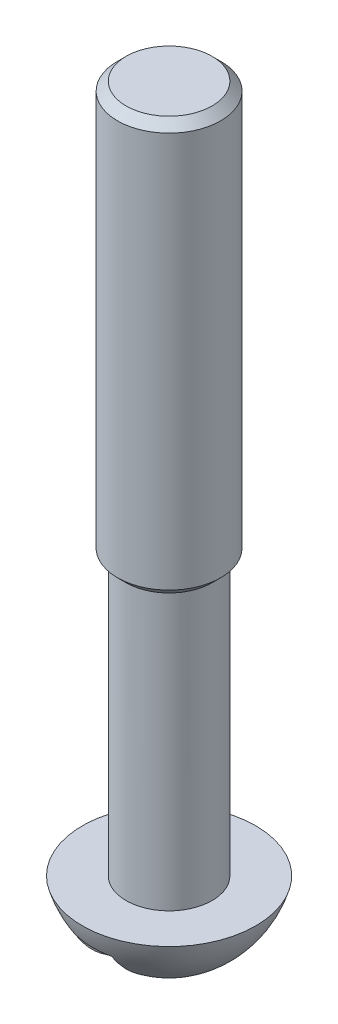
ISO-10303-21;
HEADER;
FILE_DESCRIPTION(('STEP AP214'),'2;1');
FILE_NAME('part.step','',(''),(''),'','','');
FILE_SCHEMA(('AUTOMOTIVE_DESIGN { 1 0 10303 214 1 1 1 1 }'));
ENDSEC;
DATA;
#1=APPLICATION_CONTEXT('core data for automotive mechanical design processes');
#2=APPLICATION_PROTOCOL_DEFINITION('international standard','automotive_design',2000,#1);
#3=PRODUCT_CONTEXT('',#1,'mechanical');
#4=PRODUCT('Part','Part','',(#3));
#5=PRODUCT_RELATED_PRODUCT_CATEGORY('part','',(#4));
#6=PRODUCT_DEFINITION_FORMATION('','',#4);
#7=PRODUCT_DEFINITION_CONTEXT('part definition',#1,'design');
#8=PRODUCT_DEFINITION('design','',#6,#7);
#9=PRODUCT_DEFINITION_SHAPE('','',#8);
#10=(LENGTH_UNIT() NAMED_UNIT(*) SI_UNIT(.MILLI.,.METRE.));
#11=(NAMED_UNIT(*) PLANE_ANGLE_UNIT() SI_UNIT($,.RADIAN.));
#12=(NAMED_UNIT(*) SI_UNIT($,.STERADIAN.) SOLID_ANGLE_UNIT());
#13=UNCERTAINTY_MEASURE_WITH_UNIT(LENGTH_MEASURE(1.E-05),#10,'distance_accuracy_value','');
#14=(GEOMETRIC_REPRESENTATION_CONTEXT(3) GLOBAL_UNCERTAINTY_ASSIGNED_CONTEXT((#13)) GLOBAL_UNIT_ASSIGNED_CONTEXT((#10,
#11,#12)) REPRESENTATION_CONTEXT('',''));
#15=CARTESIAN_POINT('',(0.,0.,0.));
#16=DIRECTION('',(0.,0.,1.));
#17=DIRECTION('',(1.,0.,0.));
#18=AXIS2_PLACEMENT_3D('',#15,#16,#17);
#19=CARTESIAN_POINT('',(0.,0.,0.));
#20=DIRECTION('',(0.,-1.,0.));
#21=DIRECTION('',(1.,0.,0.));
#22=AXIS2_PLACEMENT_3D('',#19,#20,#21);
#23=PLANE('',#22);
#24=CARTESIAN_POINT('',(0.,0.,0.));
#25=DIRECTION('',(0.,-1.,0.));
#26=DIRECTION('',(1.,0.,0.));
#27=AXIS2_PLACEMENT_3D('',#24,#25,#26);
#28=CIRCLE('',#27,2.52);
#29=CARTESIAN_POINT('',(2.52,0.,0.));
#30=VERTEX_POINT('',#29);
#31=EDGE_CURVE('E63',#30,#30,#28,.T.);
#32=ORIENTED_EDGE('',*,*,#31,.F.);
#33=EDGE_LOOP('',(#32));
#34=FACE_BOUND('',#33,.T.);
#35=CARTESIAN_POINT('',(0.,0.,0.));
#36=DIRECTION('',(0.,1.,0.));
#37=DIRECTION('',(-1.,0.,0.));
#38=AXIS2_PLACEMENT_3D('',#35,#36,#37);
#39=CIRCLE('',#38,1.25);
#40=CARTESIAN_POINT('',(-1.25,0.,0.));
#41=VERTEX_POINT('',#40);
#42=EDGE_CURVE('E135',#41,#41,#39,.T.);
#43=ORIENTED_EDGE('',*,*,#42,.F.);
#44=EDGE_LOOP('',(#43));
#45=FACE_BOUND('',#44,.T.);
#46=ADVANCED_FACE('F31',(#34,#45),#23,.F.);
#47=CARTESIAN_POINT('',(0.,0.787302013422015,0.));
#48=DIRECTION('',(0.,-1.,0.));
#49=DIRECTION('',(1.,0.,0.));
#50=AXIS2_PLACEMENT_3D('',#47,#48,#49);
#51=DEGENERATE_TOROIDAL_SURFACE('',#50,0.271085011185012,2.9,.F.);
#52=CARTESIAN_POINT('',(0.,-0.7,0.));
#53=DIRECTION('',(0.,1.,0.));
#54=DIRECTION('',(0.,0.,1.));
#55=AXIS2_PLACEMENT_3D('',#52,#53,#54);
#56=CIRCLE('',#55,2.21847975416471);
#57=CARTESIAN_POINT('',(0.5,-0.699999999999995,-2.16140056899195));
#58=VERTEX_POINT('',#57);
#59=CARTESIAN_POINT('',(-0.5,-0.7,-2.16140056899195));
#60=VERTEX_POINT('',#59);
#61=EDGE_CURVE('E66',#58,#60,#56,.T.);
#62=ORIENTED_EDGE('',*,*,#61,.T.);
#63=CARTESIAN_POINT('',(-0.5,-2.00830666905231,0.));
#64=CARTESIAN_POINT('',(-0.5,-2.00830902523809,0.0428607928409078));
#65=CARTESIAN_POINT('',(-0.5,-2.00677701447295,0.0857176950793083));
#66=CARTESIAN_POINT('',(-0.5,-2.00077477337984,0.171233621065701));
#67=CARTESIAN_POINT('',(-0.5,-1.99630377029604,0.213892589799023));
#68=CARTESIAN_POINT('',(-0.5,-1.98466835662272,0.298948247700139));
#69=CARTESIAN_POINT('',(-0.5,-1.97749705360507,0.341343981069012));
#70=CARTESIAN_POINT('',(-0.5,-1.96072290989855,0.425642081267895));
#71=CARTESIAN_POINT('',(-0.5,-1.95112019303028,0.467544473107811));
#72=CARTESIAN_POINT('',(-0.5,-1.92223725405787,0.579688450377579));
#73=CARTESIAN_POINT('',(-0.5,-1.90086765384547,0.649401072004694));
#74=CARTESIAN_POINT('',(-0.5,-1.85236077305985,0.786781567721751));
#75=CARTESIAN_POINT('',(-0.5,-1.82522117423046,0.854448607424066));
#76=CARTESIAN_POINT('',(-0.5,-1.7357070685999,1.05388466131537));
#77=CARTESIAN_POINT('',(-0.5,-1.66523008748747,1.18211541524716));
#78=CARTESIAN_POINT('',(-0.5,-1.50332276109899,1.42879594104105));
#79=CARTESIAN_POINT('',(-0.5,-1.41144141201418,1.54694726231623));
#80=CARTESIAN_POINT('',(-0.5,-1.21021633244569,1.76722278518401));
#81=CARTESIAN_POINT('',(-0.5,-1.10087932958539,1.86935313151299));
#82=CARTESIAN_POINT('',(-0.5,-0.860273080352937,2.06091763689049));
#83=CARTESIAN_POINT('',(-0.5,-0.728065620900349,2.14917595333445));
#84=CARTESIAN_POINT('',(-0.5,-0.450766012338848,2.30248024074104));
#85=CARTESIAN_POINT('',(-0.5,-0.305669223995743,2.36751781128017));
#86=CARTESIAN_POINT('',(-0.5,-0.00545444206719077,2.47298771259921));
#87=CARTESIAN_POINT('',(-0.5,0.149735660014806,2.5132149447268));
#88=CARTESIAN_POINT('',(-0.5,0.464641057680149,2.5670929362687));
#89=CARTESIAN_POINT('',(-0.5,0.624355819321792,2.58074681838075));
#90=CARTESIAN_POINT('',(-0.5,0.944113367836459,2.58110769648025));
#91=CARTESIAN_POINT('',(-0.5,1.10415621408669,2.56776470732811));
#92=CARTESIAN_POINT('',(-0.5,1.41977014581319,2.51439805056066));
#93=CARTESIAN_POINT('',(-0.5,1.57534014413412,2.47436795270612));
#94=CARTESIAN_POINT('',(-0.5,1.87759317317978,2.36872901137911));
#95=CARTESIAN_POINT('',(-0.5,2.02427341433807,2.30311218643132));
#96=CARTESIAN_POINT('',(-0.5,2.30440826785885,2.14818904246711));
#97=CARTESIAN_POINT('',(-0.5,2.43787250242996,2.05890013523032));
#98=CARTESIAN_POINT('',(-0.5,2.68754734098064,1.85936927954692));
#99=CARTESIAN_POINT('',(-0.5,2.80379777448819,1.749177090265));
#100=CARTESIAN_POINT('',(-0.5,3.01629762837255,1.51039076171608));
#101=CARTESIAN_POINT('',(-0.5,3.11250355365943,1.38175760649792));
#102=CARTESIAN_POINT('',(-0.5,3.23887493368555,1.17844480477896));
#103=CARTESIAN_POINT('',(-0.5,3.27792862814773,1.10914525185096));
#104=CARTESIAN_POINT('',(-0.5,3.34988755890216,0.967377816270646));
#105=CARTESIAN_POINT('',(-0.5,3.38279161292058,0.894909327685369));
#106=CARTESIAN_POINT('',(-0.5,3.44187516124072,0.747575307035428));
#107=CARTESIAN_POINT('',(-0.5,3.46807767101522,0.672718999882114));
#108=CARTESIAN_POINT('',(-0.5,3.51328086602252,0.520852572751832));
#109=CARTESIAN_POINT('',(-0.5,3.5322838918378,0.443843161515936));
#110=CARTESIAN_POINT('',(-0.5,3.55768578585015,0.310579540568608));
#111=CARTESIAN_POINT('',(-0.5,3.5661370787378,0.254715818046524));
#112=CARTESIAN_POINT('',(-0.5,3.57816501396867,0.142485469182349));
#113=CARTESIAN_POINT('',(-0.5,3.58174514159116,0.0861192314817943));
#114=CARTESIAN_POINT('',(-0.5,3.58358888853252,-0.0266645197386601));
#115=CARTESIAN_POINT('',(-0.5,3.58185618571465,-0.0830819707704476));
#116=CARTESIAN_POINT('',(-0.5,3.57331877582221,-0.195548634576939));
#117=CARTESIAN_POINT('',(-0.5,3.56651103425344,-0.251597606793419));
#118=CARTESIAN_POINT('',(-0.5,3.54637785420933,-0.375782803539229));
#119=CARTESIAN_POINT('',(-0.5,3.5319131113656,-0.443732633884875));
#120=CARTESIAN_POINT('',(-0.5,3.49718633392172,-0.578125062699261));
#121=CARTESIAN_POINT('',(-0.5,3.47692300041911,-0.644567319863809));
#122=CARTESIAN_POINT('',(-0.5,3.43105557355988,-0.775837565642575));
#123=CARTESIAN_POINT('',(-0.5,3.40543329582803,-0.840659194226015));
#124=CARTESIAN_POINT('',(-0.5,3.34926248124926,-0.968098039765201));
#125=CARTESIAN_POINT('',(-0.5,3.31871469013967,-1.03071558867944));
#126=CARTESIAN_POINT('',(-0.5,3.21919823082042,-1.216454526155));
#127=CARTESIAN_POINT('',(-0.5,3.14295294179025,-1.33577533609196));
#128=CARTESIAN_POINT('',(-0.5,2.97362070509193,-1.56133292921711));
#129=CARTESIAN_POINT('',(-0.5,2.88056481387892,-1.66759324245783));
#130=CARTESIAN_POINT('',(-0.5,2.66793948747481,-1.87659633287979));
#131=CARTESIAN_POINT('',(-0.5,2.54654543403006,-1.97749429271548));
#132=CARTESIAN_POINT('',(-0.5,2.28862110586937,-2.15788733905101));
#133=CARTESIAN_POINT('',(-0.5,2.15207512678454,-2.2373599209244));
#134=CARTESIAN_POINT('',(-0.5,1.86583734923645,-2.37352878804972));
#135=CARTESIAN_POINT('',(-0.5,1.71599605796425,-2.42991120492598));
#136=CARTESIAN_POINT('',(-0.5,1.40903330432197,-2.5167871749865));
#137=CARTESIAN_POINT('',(-0.5,1.25191367325997,-2.54728720354392));
#138=CARTESIAN_POINT('',(-0.5,0.934290181022326,-2.58162938572399));
#139=CARTESIAN_POINT('',(-0.5,0.773777309344931,-2.58538828009068));
#140=CARTESIAN_POINT('',(-0.5,0.454382437326888,-2.56592048393626));
#141=CARTESIAN_POINT('',(-0.5,0.295500587091198,-2.54269133173875));
#142=CARTESIAN_POINT('',(-0.5,-0.0161898657472835,-2.4698761216843));
#143=CARTESIAN_POINT('',(-0.5,-0.168995378013231,-2.42027683206015));
#144=CARTESIAN_POINT('',(-0.5,-0.464091287042087,-2.29610912288206));
#145=CARTESIAN_POINT('',(-0.5,-0.606382220836688,-2.22154197963776));
#146=CARTESIAN_POINT('',(-0.5,-0.876260298813449,-2.04960277928083));
#147=CARTESIAN_POINT('',(-0.5,-1.00386164773157,-1.95225303390011));
#148=CARTESIAN_POINT('',(-0.5,-1.24082238448772,-1.73744423057207));
#149=CARTESIAN_POINT('',(-0.5,-1.35018077277265,-1.61998407146574));
#150=CARTESIAN_POINT('',(-0.5,-1.54695971528993,-1.36869643690514));
#151=CARTESIAN_POINT('',(-0.5,-1.63448083863165,-1.23494837977945));
#152=CARTESIAN_POINT('',(-0.5,-1.74748301022448,-1.02460752044256));
#153=CARTESIAN_POINT('',(-0.5,-1.7821277229314,-0.952802126809185));
#154=CARTESIAN_POINT('',(-0.5,-1.84490049228109,-0.806412377112441));
#155=CARTESIAN_POINT('',(-0.5,-1.8730328170853,-0.731829878564861));
#156=CARTESIAN_POINT('',(-0.5,-1.91484944880954,-0.603033392826844));
#157=CARTESIAN_POINT('',(-0.5,-1.93033848924262,-0.549398661873268));
#158=CARTESIAN_POINT('',(-0.5,-1.95752526788402,-0.441168906034976));
#159=CARTESIAN_POINT('',(-0.5,-1.96922330554232,-0.386573957356848));
#160=CARTESIAN_POINT('',(-0.5,-1.98831800484734,-0.276860890273204));
#161=CARTESIAN_POINT('',(-0.5,-1.99573246011595,-0.221745916878929));
#162=CARTESIAN_POINT('',(-0.5,-2.00572419134632,-0.111084983102166));
#163=CARTESIAN_POINT('',(-0.5,-2.00830361589523,-0.05553922517566));
#164=CARTESIAN_POINT('',(-0.5,-2.00830666905231,0.));
#165=B_SPLINE_CURVE_WITH_KNOTS('',3,(#63,#64,#65,#66,#67,#68,#69,#70,#71,#72,#73,#74,#75,#76,
#77,#78,#79,#80,#81,#82,#83,#84,#85,#86,#87,#88,#89,#90,#91,#92,#93,#94,#95,#96,#97,#98,#99,
#100,#101,#102,#103,#104,#105,#106,#107,#108,#109,#110,#111,#112,#113,#114,#115,#116,#117,#118,
#119,#120,#121,#122,#123,#124,#125,#126,#127,#128,#129,#130,#131,#132,#133,#134,#135,#136,#137,
#138,#139,#140,#141,#142,#143,#144,#145,#146,#147,#148,#149,#150,#151,#152,#153,#154,#155,#156,
#157,#158,#159,#160,#161,#162,#163,#164),.UNSPECIFIED.,.T.,.F.,(4,2,2,2,2,2,2,2,2,2,2,2,2,2,2,2,
2,2,2,2,2,2,2,2,2,2,2,2,2,2,2,2,2,2,2,2,2,2,2,2,2,2,2,2,2,2,2,2,2,2,4),(0.,0.128549890420901,
0.257133594278979,0.38604775350707,0.514955349056843,0.733388158692688,0.951908896149971,
1.38886811132146,1.83603449032034,2.2830289401214,2.75766808537321,3.23247876428289,
3.7111637009508,4.18979238281254,4.66930806427601,5.14893932646848,5.62872032377173,
6.10814939702517,6.5864512193134,7.06578035331483,7.30417625808895,7.54261794764793,
7.78022940177217,8.01776354099072,8.18708446097374,8.35628416939137,8.52536677396586,
8.69455055848108,8.90266478459222,9.1108256654822,9.3197046989318,9.52855213712079,
9.95155880225897,10.3737918375563,10.8451078962781,11.3169171004645,11.7949423106178,
12.2728478909701,12.7522407948426,13.2316774292923,13.7113548584433,14.19100777113,
14.6701928956692,15.149404266703,15.6263661627454,15.8652960746778,16.1040689478955,
16.2714320712356,16.4387819713975,16.6054316218962,16.7720071991818),.UNSPECIFIED.);
#166=CARTESIAN_POINT('',(-0.5,-0.7,2.16140056899195));
#167=VERTEX_POINT('',#166);
#168=EDGE_CURVE('E73',#60,#167,#165,.T.);
#169=ORIENTED_EDGE('',*,*,#168,.T.);
#170=CARTESIAN_POINT('',(0.5,-0.7,2.16140056899192));
#171=VERTEX_POINT('',#170);
#172=EDGE_CURVE('E52',#167,#171,#56,.T.);
#173=ORIENTED_EDGE('',*,*,#172,.T.);
#174=CARTESIAN_POINT('',(0.5,-2.00830666905231,0.));
#175=CARTESIAN_POINT('',(0.5,-2.00830902523809,-0.0428607928409077));
#176=CARTESIAN_POINT('',(0.5,-2.00677701447295,-0.0857176950793083));
#177=CARTESIAN_POINT('',(0.5,-2.00077477337984,-0.171233621065701));
#178=CARTESIAN_POINT('',(0.5,-1.99630377029604,-0.213892589799023));
#179=CARTESIAN_POINT('',(0.5,-1.98466835662272,-0.298948247700139));
#180=CARTESIAN_POINT('',(0.5,-1.97749705360507,-0.341343981069012));
#181=CARTESIAN_POINT('',(0.5,-1.96072290989855,-0.425642081267895));
#182=CARTESIAN_POINT('',(0.5,-1.95112019303028,-0.467544473107811));
#183=CARTESIAN_POINT('',(0.5,-1.92223725405787,-0.579688450377579));
#184=CARTESIAN_POINT('',(0.5,-1.90086765384547,-0.649401072004694));
#185=CARTESIAN_POINT('',(0.5,-1.85236077305985,-0.786781567721752));
#186=CARTESIAN_POINT('',(0.5,-1.82522117423046,-0.854448607424066));
#187=CARTESIAN_POINT('',(0.5,-1.7357070685999,-1.05388466131537));
#188=CARTESIAN_POINT('',(0.5,-1.66523008748747,-1.18211541524716));
#189=CARTESIAN_POINT('',(0.5,-1.50332276109899,-1.42879594104105));
#190=CARTESIAN_POINT('',(0.5,-1.41144141201418,-1.54694726231623));
#191=CARTESIAN_POINT('',(0.5,-1.21021633244569,-1.76722278518401));
#192=CARTESIAN_POINT('',(0.5,-1.10087932958539,-1.86935313151299));
#193=CARTESIAN_POINT('',(0.5,-0.860273080352937,-2.06091763689049));
#194=CARTESIAN_POINT('',(0.5,-0.728065620900348,-2.14917595333445));
#195=CARTESIAN_POINT('',(0.5,-0.450766012338847,-2.30248024074104));
#196=CARTESIAN_POINT('',(0.5,-0.305669223995742,-2.36751781128017));
#197=CARTESIAN_POINT('',(0.5,-0.00545444206719042,-2.47298771259921));
#198=CARTESIAN_POINT('',(0.5,0.149735660014806,-2.5132149447268));
#199=CARTESIAN_POINT('',(0.5,0.46464105768015,-2.5670929362687));
#200=CARTESIAN_POINT('',(0.5,0.624355819321793,-2.58074681838075));
#201=CARTESIAN_POINT('',(0.5,0.94411336783646,-2.58110769648025));
#202=CARTESIAN_POINT('',(0.5,1.10415621408669,-2.56776470732811));
#203=CARTESIAN_POINT('',(0.5,1.41977014581319,-2.51439805056066));
#204=CARTESIAN_POINT('',(0.5,1.57534014413412,-2.47436795270612));
#205=CARTESIAN_POINT('',(0.5,1.87759317317978,-2.36872901137911));
#206=CARTESIAN_POINT('',(0.499999999999999,2.02427341433807,-2.30311218643132));
#207=CARTESIAN_POINT('',(0.499999999999999,2.30440826785885,-2.1481890424671));
#208=CARTESIAN_POINT('',(0.499999999999999,2.43787250242996,-2.05890013523032));
#209=CARTESIAN_POINT('',(0.499999999999999,2.68754734098064,-1.85936927954692));
#210=CARTESIAN_POINT('',(0.499999999999999,2.80379777448819,-1.749177090265));
#211=CARTESIAN_POINT('',(0.499999999999999,3.01629762837255,-1.51039076171608));
#212=CARTESIAN_POINT('',(0.499999999999999,3.11250355365943,-1.38175760649792));
#213=CARTESIAN_POINT('',(0.499999999999999,3.23887493368555,-1.17844480477896));
#214=CARTESIAN_POINT('',(0.499999999999999,3.27792862814773,-1.10914525185096));
#215=CARTESIAN_POINT('',(0.499999999999999,3.34988755890216,-0.967377816270646));
#216=CARTESIAN_POINT('',(0.499999999999999,3.38279161292058,-0.89490932768537));
#217=CARTESIAN_POINT('',(0.499999999999999,3.44187516124072,-0.747575307035428));
#218=CARTESIAN_POINT('',(0.499999999999999,3.46807767101522,-0.672718999882114));
#219=CARTESIAN_POINT('',(0.499999999999999,3.51328086602252,-0.520852572751832));
#220=CARTESIAN_POINT('',(0.499999999999999,3.5322838918378,-0.443843161515936));
#221=CARTESIAN_POINT('',(0.499999999999999,3.55768578585015,-0.310579540568608));
#222=CARTESIAN_POINT('',(0.499999999999999,3.5661370787378,-0.254715818046524));
#223=CARTESIAN_POINT('',(0.499999999999999,3.57816501396867,-0.142485469182349));
#224=CARTESIAN_POINT('',(0.499999999999999,3.58174514159116,-0.0861192314817943));
#225=CARTESIAN_POINT('',(0.499999999999999,3.58358888853252,0.0266645197386601));
#226=CARTESIAN_POINT('',(0.499999999999999,3.58185618571465,0.0830819707704476));
#227=CARTESIAN_POINT('',(0.499999999999999,3.57331877582221,0.195548634576939));
#228=CARTESIAN_POINT('',(0.499999999999999,3.56651103425344,0.251597606793419));
#229=CARTESIAN_POINT('',(0.499999999999999,3.54637785420933,0.375782803539229));
#230=CARTESIAN_POINT('',(0.499999999999999,3.5319131113656,0.443732633884875));
#231=CARTESIAN_POINT('',(0.499999999999999,3.49718633392172,0.578125062699261));
#232=CARTESIAN_POINT('',(0.499999999999999,3.47692300041911,0.64456731986381));
#233=CARTESIAN_POINT('',(0.499999999999999,3.43105557355988,0.775837565642575));
#234=CARTESIAN_POINT('',(0.499999999999999,3.40543329582803,0.840659194226015));
#235=CARTESIAN_POINT('',(0.499999999999999,3.34926248124926,0.968098039765201));
#236=CARTESIAN_POINT('',(0.499999999999999,3.31871469013967,1.03071558867944));
#237=CARTESIAN_POINT('',(0.499999999999999,3.21919823082042,1.216454526155));
#238=CARTESIAN_POINT('',(0.499999999999999,3.14295294179025,1.33577533609196));
#239=CARTESIAN_POINT('',(0.499999999999999,2.97362070509193,1.56133292921711));
#240=CARTESIAN_POINT('',(0.499999999999999,2.88056481387892,1.66759324245783));
#241=CARTESIAN_POINT('',(0.499999999999999,2.66793948747481,1.87659633287979));
#242=CARTESIAN_POINT('',(0.499999999999999,2.54654543403006,1.97749429271548));
#243=CARTESIAN_POINT('',(0.499999999999999,2.28862110586937,2.15788733905101));
#244=CARTESIAN_POINT('',(0.499999999999999,2.15207512678454,2.2373599209244));
#245=CARTESIAN_POINT('',(0.499999999999999,1.86583734923645,2.37352878804972));
#246=CARTESIAN_POINT('',(0.5,1.71599605796425,2.42991120492598));
#247=CARTESIAN_POINT('',(0.5,1.40903330432198,2.5167871749865));
#248=CARTESIAN_POINT('',(0.5,1.25191367325997,2.54728720354392));
#249=CARTESIAN_POINT('',(0.5,0.934290181022327,2.58162938572399));
#250=CARTESIAN_POINT('',(0.5,0.773777309344932,2.58538828009068));
#251=CARTESIAN_POINT('',(0.5,0.454382437326889,2.56592048393626));
#252=CARTESIAN_POINT('',(0.5,0.295500587091199,2.54269133173875));
#253=CARTESIAN_POINT('',(0.5,-0.0161898657472827,2.4698761216843));
#254=CARTESIAN_POINT('',(0.5,-0.16899537801323,2.42027683206015));
#255=CARTESIAN_POINT('',(0.5,-0.464091287042086,2.29610912288206));
#256=CARTESIAN_POINT('',(0.5,-0.606382220836687,2.22154197963777));
#257=CARTESIAN_POINT('',(0.5,-0.876260298813447,2.04960277928083));
#258=CARTESIAN_POINT('',(0.5,-1.00386164773157,1.95225303390012));
#259=CARTESIAN_POINT('',(0.5,-1.24082238448772,1.73744423057207));
#260=CARTESIAN_POINT('',(0.5,-1.35018077277265,1.61998407146574));
#261=CARTESIAN_POINT('',(0.5,-1.54695971528993,1.36869643690514));
#262=CARTESIAN_POINT('',(0.5,-1.63448083863165,1.23494837977945));
#263=CARTESIAN_POINT('',(0.5,-1.74748301022448,1.02460752044256));
#264=CARTESIAN_POINT('',(0.5,-1.7821277229314,0.952802126809186));
#265=CARTESIAN_POINT('',(0.5,-1.84490049228109,0.806412377112441));
#266=CARTESIAN_POINT('',(0.5,-1.8730328170853,0.731829878564862));
#267=CARTESIAN_POINT('',(0.5,-1.91484944880954,0.603033392826845));
#268=CARTESIAN_POINT('',(0.5,-1.93033848924262,0.549398661873269));
#269=CARTESIAN_POINT('',(0.5,-1.95752526788402,0.441168906034977));
#270=CARTESIAN_POINT('',(0.5,-1.96922330554232,0.38657395735685));
#271=CARTESIAN_POINT('',(0.5,-1.98831800484734,0.276860890273205));
#272=CARTESIAN_POINT('',(0.5,-1.99573246011595,0.221745916878929));
#273=CARTESIAN_POINT('',(0.5,-2.00572419134632,0.111084983102165));
#274=CARTESIAN_POINT('',(0.5,-2.00830361589523,0.0555392251756597));
#275=CARTESIAN_POINT('',(0.5,-2.00830666905231,0.));
#276=B_SPLINE_CURVE_WITH_KNOTS('',3,(#174,#175,#176,#177,#178,#179,#180,#181,#182,#183,#184,
#185,#186,#187,#188,#189,#190,#191,#192,#193,#194,#195,#196,#197,#198,#199,#200,#201,#202,#203,
#204,#205,#206,#207,#208,#209,#210,#211,#212,#213,#214,#215,#216,#217,#218,#219,#220,#221,#222,
#223,#224,#225,#226,#227,#228,#229,#230,#231,#232,#233,#234,#235,#236,#237,#238,#239,#240,#241,
#242,#243,#244,#245,#246,#247,#248,#249,#250,#251,#252,#253,#254,#255,#256,#257,#258,#259,#260,
#261,#262,#263,#264,#265,#266,#267,#268,#269,#270,#271,#272,#273,#274,#275),.UNSPECIFIED.,.T.,
.F.,(4,2,2,2,2,2,2,2,2,2,2,2,2,2,2,2,2,2,2,2,2,2,2,2,2,2,2,2,2,2,2,2,2,2,2,2,2,2,2,2,2,2,2,2,2,
2,2,2,2,2,4),(0.,0.128549890420901,0.257133594278978,0.38604775350707,0.514955349056843,
0.733388158692688,0.951908896149971,1.38886811132146,1.83603449032035,2.2830289401214,
2.75766808537321,3.23247876428289,3.7111637009508,4.18979238281254,4.66930806427601,
5.14893932646848,5.62872032377173,6.10814939702517,6.5864512193134,7.06578035331483,
7.30417625808895,7.54261794764793,7.78022940177217,8.01776354099073,8.18708446097374,
8.35628416939137,8.52536677396586,8.69455055848108,8.90266478459222,9.1108256654822,
9.3197046989318,9.52855213712079,9.95155880225897,10.3737918375563,10.8451078962781,
11.3169171004645,11.7949423106178,12.2728478909701,12.7522407948426,13.2316774292923,
13.7113548584433,14.19100777113,14.6701928956692,15.149404266703,15.6263661627454,
15.8652960746778,16.1040689478955,16.2714320712356,16.4387819713975,16.6054316218962,
16.7720071991818),.UNSPECIFIED.);
#277=EDGE_CURVE('E59',#171,#58,#276,.T.);
#278=ORIENTED_EDGE('',*,*,#277,.T.);
#279=EDGE_LOOP('',(#62,#169,#173,#278));
#280=FACE_BOUND('',#279,.T.);
#281=ORIENTED_EDGE('',*,*,#31,.T.);
#282=EDGE_LOOP('',(#281));
#283=FACE_BOUND('',#282,.T.);
#284=ADVANCED_FACE('F71',(#280,#283),#51,.F.);
#285=CARTESIAN_POINT('',(-0.5,-4.63806179955192,-2.52));
#286=DIRECTION('',(-1.,0.,0.));
#287=DIRECTION('',(0.,0.,1.));
#288=AXIS2_PLACEMENT_3D('',#285,#286,#287);
#289=PLANE('',#288);
#290=DIRECTION('',(0.,0.,1.));
#291=VECTOR('',#290,1.);
#292=CARTESIAN_POINT('',(-0.5,-0.7,-2.52));
#293=LINE('',#292,#291);
#294=EDGE_CURVE('E67',#60,#167,#293,.T.);
#295=ORIENTED_EDGE('',*,*,#294,.T.);
#296=ORIENTED_EDGE('',*,*,#168,.F.);
#297=EDGE_LOOP('',(#295,#296));
#298=FACE_BOUND('',#297,.T.);
#299=ADVANCED_FACE('F88',(#298),#289,.F.);
#300=CARTESIAN_POINT('',(-0.5,-0.7,-2.52));
#301=DIRECTION('',(0.,1.,0.));
#302=DIRECTION('',(0.,0.,1.));
#303=AXIS2_PLACEMENT_3D('',#300,#301,#302);
#304=PLANE('',#303);
#305=DIRECTION('',(0.,0.,1.));
#306=VECTOR('',#305,1.);
#307=CARTESIAN_POINT('',(0.5,-0.7,-2.52));
#308=LINE('',#307,#306);
#309=EDGE_CURVE('E45',#58,#171,#308,.T.);
#310=ORIENTED_EDGE('',*,*,#309,.T.);
#311=ORIENTED_EDGE('',*,*,#172,.F.);
#312=ORIENTED_EDGE('',*,*,#294,.F.);
#313=ORIENTED_EDGE('',*,*,#61,.F.);
#314=EDGE_LOOP('',(#310,#311,#312,#313));
#315=FACE_BOUND('',#314,.T.);
#316=ADVANCED_FACE('F65',(#315),#304,.F.);
#317=CARTESIAN_POINT('',(0.5,-0.7,-2.52));
#318=DIRECTION('',(1.,0.,0.));
#319=DIRECTION('',(0.,1.,0.));
#320=AXIS2_PLACEMENT_3D('',#317,#318,#319);
#321=PLANE('',#320);
#322=ORIENTED_EDGE('',*,*,#309,.F.);
#323=ORIENTED_EDGE('',*,*,#277,.F.);
#324=EDGE_LOOP('',(#322,#323));
#325=FACE_BOUND('',#324,.T.);
#326=ADVANCED_FACE('F60',(#325),#321,.F.);
#327=CARTESIAN_POINT('',(0.,8.,0.));
#328=DIRECTION('',(0.,-1.,0.));
#329=DIRECTION('',(1.,0.,0.));
#330=AXIS2_PLACEMENT_3D('',#327,#328,#329);
#331=CYLINDRICAL_SURFACE('',#330,1.25);
#332=CARTESIAN_POINT('',(0.,8.,0.));
#333=DIRECTION('',(0.,1.,0.));
#334=DIRECTION('',(-1.,0.,0.));
#335=AXIS2_PLACEMENT_3D('',#332,#333,#334);
#336=CIRCLE('',#335,1.25);
#337=CARTESIAN_POINT('',(-1.25,8.,0.));
#338=VERTEX_POINT('',#337);
#339=EDGE_CURVE('E68',#338,#338,#336,.T.);
#340=ORIENTED_EDGE('',*,*,#339,.F.);
#341=EDGE_LOOP('',(#340));
#342=FACE_BOUND('',#341,.T.);
#343=ORIENTED_EDGE('',*,*,#42,.T.);
#344=EDGE_LOOP('',(#343));
#345=FACE_BOUND('',#344,.T.);
#346=ADVANCED_FACE('F95',(#342,#345),#331,.T.);
#347=CARTESIAN_POINT('',(0.,20.,0.));
#348=DIRECTION('',(0.,1.,0.));
#349=DIRECTION('',(0.,0.,1.));
#350=AXIS2_PLACEMENT_3D('',#347,#348,#349);
#351=PLANE('',#350);
#352=CARTESIAN_POINT('',(0.,20.,0.));
#353=DIRECTION('',(0.,1.,0.));
#354=DIRECTION('',(0.,0.,1.));
#355=AXIS2_PLACEMENT_3D('',#352,#353,#354);
#356=CIRCLE('',#355,1.25);
#357=CARTESIAN_POINT('',(0.,20.,1.25));
#358=VERTEX_POINT('',#357);
#359=EDGE_CURVE('E11',#358,#358,#356,.T.);
#360=ORIENTED_EDGE('',*,*,#359,.T.);
#361=EDGE_LOOP('',(#360));
#362=FACE_BOUND('',#361,.T.);
#363=ADVANCED_FACE('F99',(#362),#351,.T.);
#364=CARTESIAN_POINT('',(0.,20.,0.));
#365=DIRECTION('',(0.,-1.,0.));
#366=DIRECTION('',(0.,0.,-1.));
#367=AXIS2_PLACEMENT_3D('',#364,#365,#366);
#368=CYLINDRICAL_SURFACE('',#367,1.5);
#369=CARTESIAN_POINT('',(0.,8.25,0.));
#370=DIRECTION('',(0.,1.,0.));
#371=DIRECTION('',(0.,0.,1.));
#372=AXIS2_PLACEMENT_3D('',#369,#370,#371);
#373=CIRCLE('',#372,1.5);
#374=CARTESIAN_POINT('',(0.,8.25,1.5));
#375=VERTEX_POINT('',#374);
#376=EDGE_CURVE('E39',#375,#375,#373,.T.);
#377=ORIENTED_EDGE('',*,*,#376,.T.);
#378=EDGE_LOOP('',(#377));
#379=FACE_BOUND('',#378,.T.);
#380=CARTESIAN_POINT('',(0.,19.75,0.));
#381=DIRECTION('',(0.,1.,0.));
#382=DIRECTION('',(0.,0.,1.));
#383=AXIS2_PLACEMENT_3D('',#380,#381,#382);
#384=CIRCLE('',#383,1.5);
#385=CARTESIAN_POINT('',(0.,19.75,1.5));
#386=VERTEX_POINT('',#385);
#387=EDGE_CURVE('E85',#386,#386,#384,.F.);
#388=ORIENTED_EDGE('',*,*,#387,.T.);
#389=EDGE_LOOP('',(#388));
#390=FACE_BOUND('',#389,.T.);
#391=ADVANCED_FACE('F104',(#379,#390),#368,.T.);
#392=CARTESIAN_POINT('',(0.,8.25,0.));
#393=DIRECTION('',(0.,1.,0.));
#394=DIRECTION('',(0.,0.,1.));
#395=AXIS2_PLACEMENT_3D('',#392,#393,#394);
#396=CONICAL_SURFACE('',#395,1.5,0.785398163397453);
#397=ORIENTED_EDGE('',*,*,#339,.T.);
#398=EDGE_LOOP('',(#397));
#399=FACE_BOUND('',#398,.T.);
#400=ORIENTED_EDGE('',*,*,#376,.F.);
#401=EDGE_LOOP('',(#400));
#402=FACE_BOUND('',#401,.T.);
#403=ADVANCED_FACE('F118',(#399,#402),#396,.T.);
#404=CARTESIAN_POINT('',(0.,20.,0.));
#405=DIRECTION('',(0.,-1.,0.));
#406=DIRECTION('',(0.,0.,-1.));
#407=AXIS2_PLACEMENT_3D('',#404,#405,#406);
#408=CONICAL_SURFACE('',#407,1.25,0.785398163397453);
#409=ORIENTED_EDGE('',*,*,#387,.F.);
#410=EDGE_LOOP('',(#409));
#411=FACE_BOUND('',#410,.T.);
#412=ORIENTED_EDGE('',*,*,#359,.F.);
#413=EDGE_LOOP('',(#412));
#414=FACE_BOUND('',#413,.T.);
#415=ADVANCED_FACE('F33',(#411,#414),#408,.T.);
#416=CLOSED_SHELL('',(#46,#284,#299,#316,#326,#346,#363,#391,#403,#415));
#417=MANIFOLD_SOLID_BREP('B2',#416);
#418=ADVANCED_BREP_SHAPE_REPRESENTATION('',(#18,#417),#14);
#419=SHAPE_DEFINITION_REPRESENTATION(#9,#418);
ENDSEC;
END-ISO-10303-21;
